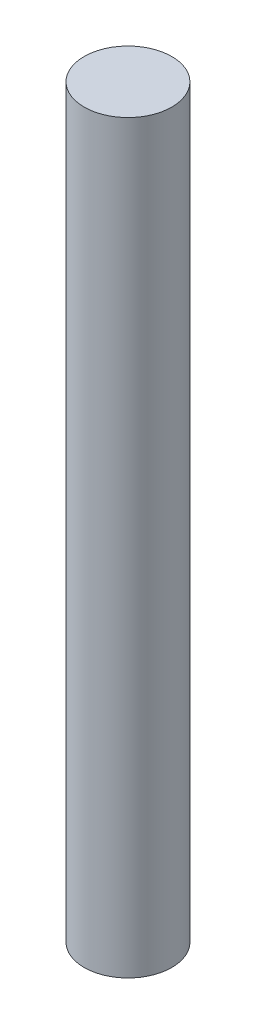
ISO-10303-21;
HEADER;
FILE_DESCRIPTION(('STEP AP214'),'2;1');
FILE_NAME('part.step','',(''),(''),'','','');
FILE_SCHEMA(('AUTOMOTIVE_DESIGN { 1 0 10303 214 1 1 1 1 }'));
ENDSEC;
DATA;
#1=APPLICATION_CONTEXT('core data for automotive mechanical design processes');
#2=APPLICATION_PROTOCOL_DEFINITION('international standard','automotive_design',2000,#1);
#3=PRODUCT_CONTEXT('',#1,'mechanical');
#4=PRODUCT('Part','Part','',(#3));
#5=PRODUCT_RELATED_PRODUCT_CATEGORY('part','',(#4));
#6=PRODUCT_DEFINITION_FORMATION('','',#4);
#7=PRODUCT_DEFINITION_CONTEXT('part definition',#1,'design');
#8=PRODUCT_DEFINITION('design','',#6,#7);
#9=PRODUCT_DEFINITION_SHAPE('','',#8);
#10=(LENGTH_UNIT() NAMED_UNIT(*) SI_UNIT(.MILLI.,.METRE.));
#11=(NAMED_UNIT(*) PLANE_ANGLE_UNIT() SI_UNIT($,.RADIAN.));
#12=(NAMED_UNIT(*) SI_UNIT($,.STERADIAN.) SOLID_ANGLE_UNIT());
#13=UNCERTAINTY_MEASURE_WITH_UNIT(LENGTH_MEASURE(1.E-05),#10,'distance_accuracy_value','');
#14=(GEOMETRIC_REPRESENTATION_CONTEXT(3) GLOBAL_UNCERTAINTY_ASSIGNED_CONTEXT((#13)) GLOBAL_UNIT_ASSIGNED_CONTEXT((#10,
#11,#12)) REPRESENTATION_CONTEXT('',''));
#15=CARTESIAN_POINT('',(0.,0.,0.));
#16=DIRECTION('',(0.,0.,1.));
#17=DIRECTION('',(1.,0.,0.));
#18=AXIS2_PLACEMENT_3D('',#15,#16,#17);
#19=CARTESIAN_POINT('',(0.,85.,0.));
#20=DIRECTION('',(0.,-1.,0.));
#21=DIRECTION('',(0.,0.,-1.));
#22=AXIS2_PLACEMENT_3D('',#19,#20,#21);
#23=CYLINDRICAL_SURFACE('',#22,5.);
#24=CARTESIAN_POINT('',(0.,85.,0.));
#25=DIRECTION('',(0.,1.,0.));
#26=DIRECTION('',(0.,0.,1.));
#27=AXIS2_PLACEMENT_3D('',#24,#25,#26);
#28=CIRCLE('',#27,5.);
#29=CARTESIAN_POINT('',(0.,85.,5.));
#30=VERTEX_POINT('',#29);
#31=EDGE_CURVE('E10',#30,#30,#28,.T.);
#32=ORIENTED_EDGE('',*,*,#31,.F.);
#33=EDGE_LOOP('',(#32));
#34=FACE_BOUND('',#33,.T.);
#35=CARTESIAN_POINT('',(0.,0.,0.));
#36=DIRECTION('',(0.,1.,0.));
#37=DIRECTION('',(0.,0.,1.));
#38=AXIS2_PLACEMENT_3D('',#35,#36,#37);
#39=CIRCLE('',#38,5.);
#40=CARTESIAN_POINT('',(0.,0.,5.));
#41=VERTEX_POINT('',#40);
#42=EDGE_CURVE('E46',#41,#41,#39,.T.);
#43=ORIENTED_EDGE('',*,*,#42,.T.);
#44=EDGE_LOOP('',(#43));
#45=FACE_BOUND('',#44,.T.);
#46=ADVANCED_FACE('F43',(#34,#45),#23,.T.);
#47=CARTESIAN_POINT('',(0.,85.,0.));
#48=DIRECTION('',(0.,1.,0.));
#49=DIRECTION('',(0.,0.,1.));
#50=AXIS2_PLACEMENT_3D('',#47,#48,#49);
#51=PLANE('',#50);
#52=ORIENTED_EDGE('',*,*,#31,.T.);
#53=EDGE_LOOP('',(#52));
#54=FACE_BOUND('',#53,.T.);
#55=ADVANCED_FACE('F58',(#54),#51,.T.);
#56=CARTESIAN_POINT('',(0.,0.,0.));
#57=DIRECTION('',(0.,1.,0.));
#58=DIRECTION('',(0.,0.,1.));
#59=AXIS2_PLACEMENT_3D('',#56,#57,#58);
#60=PLANE('',#59);
#61=ORIENTED_EDGE('',*,*,#42,.F.);
#62=EDGE_LOOP('',(#61));
#63=FACE_BOUND('',#62,.T.);
#64=ADVANCED_FACE('F59',(#63),#60,.F.);
#65=CLOSED_SHELL('',(#46,#55,#64));
#66=MANIFOLD_SOLID_BREP('B2',#65);
#67=ADVANCED_BREP_SHAPE_REPRESENTATION('',(#18,#66),#14);
#68=SHAPE_DEFINITION_REPRESENTATION(#9,#67);
ENDSEC;
END-ISO-10303-21;
